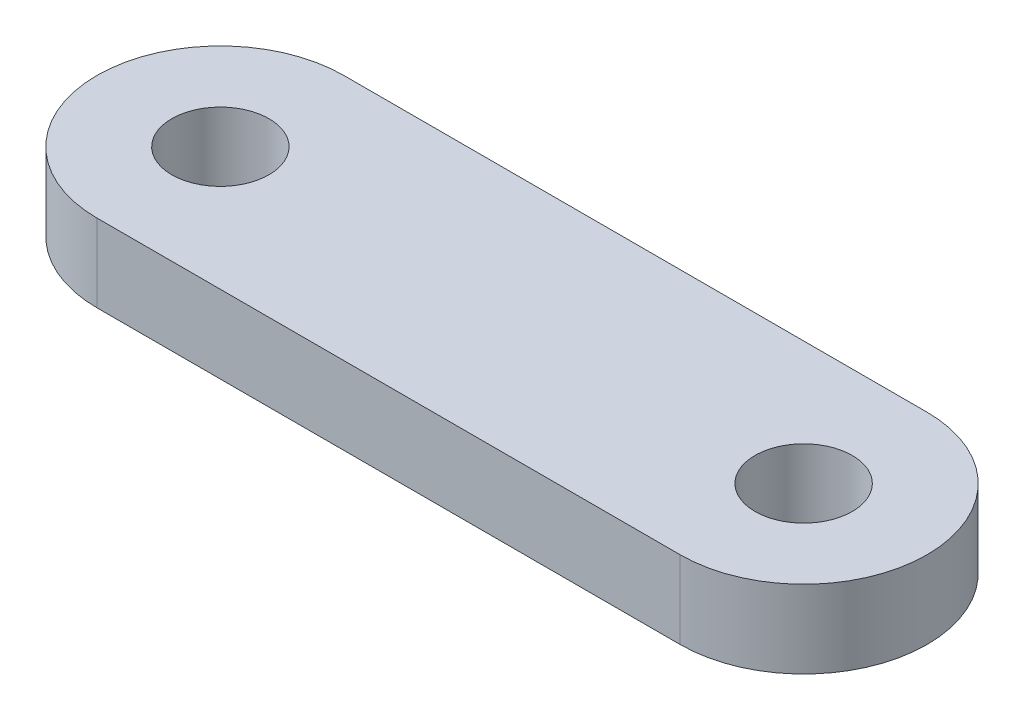
ISO-10303-21;
HEADER;
FILE_DESCRIPTION(('STEP AP214'),'2;1');
FILE_NAME('part.step','',(''),(''),'','','');
FILE_SCHEMA(('AUTOMOTIVE_DESIGN { 1 0 10303 214 1 1 1 1 }'));
ENDSEC;
DATA;
#1=APPLICATION_CONTEXT('core data for automotive mechanical design processes');
#2=APPLICATION_PROTOCOL_DEFINITION('international standard','automotive_design',2000,#1);
#3=PRODUCT_CONTEXT('',#1,'mechanical');
#4=PRODUCT('Part','Part','',(#3));
#5=PRODUCT_RELATED_PRODUCT_CATEGORY('part','',(#4));
#6=PRODUCT_DEFINITION_FORMATION('','',#4);
#7=PRODUCT_DEFINITION_CONTEXT('part definition',#1,'design');
#8=PRODUCT_DEFINITION('design','',#6,#7);
#9=PRODUCT_DEFINITION_SHAPE('','',#8);
#10=(LENGTH_UNIT() NAMED_UNIT(*) SI_UNIT(.MILLI.,.METRE.));
#11=(NAMED_UNIT(*) PLANE_ANGLE_UNIT() SI_UNIT($,.RADIAN.));
#12=(NAMED_UNIT(*) SI_UNIT($,.STERADIAN.) SOLID_ANGLE_UNIT());
#13=UNCERTAINTY_MEASURE_WITH_UNIT(LENGTH_MEASURE(1.E-05),#10,'distance_accuracy_value','');
#14=(GEOMETRIC_REPRESENTATION_CONTEXT(3) GLOBAL_UNCERTAINTY_ASSIGNED_CONTEXT((#13)) GLOBAL_UNIT_ASSIGNED_CONTEXT((#10,
#11,#12)) REPRESENTATION_CONTEXT('',''));
#15=CARTESIAN_POINT('',(0.,0.,0.));
#16=DIRECTION('',(0.,0.,1.));
#17=DIRECTION('',(1.,0.,0.));
#18=AXIS2_PLACEMENT_3D('',#15,#16,#17);
#19=CARTESIAN_POINT('',(-30.,4.,0.));
#20=DIRECTION('',(0.,1.,0.));
#21=DIRECTION('',(0.,0.,1.));
#22=AXIS2_PLACEMENT_3D('',#19,#20,#21);
#23=PLANE('',#22);
#24=CARTESIAN_POINT('',(-30.,4.,0.));
#25=DIRECTION('',(0.,1.,0.));
#26=DIRECTION('',(0.,0.,1.));
#27=AXIS2_PLACEMENT_3D('',#24,#25,#26);
#28=CIRCLE('',#27,5.);
#29=CARTESIAN_POINT('',(-30.,4.,5.));
#30=VERTEX_POINT('',#29);
#31=EDGE_CURVE('E105',#30,#30,#28,.T.);
#32=ORIENTED_EDGE('',*,*,#31,.F.);
#33=EDGE_LOOP('',(#32));
#34=FACE_BOUND('',#33,.T.);
#35=CARTESIAN_POINT('',(-30.,4.,0.));
#36=DIRECTION('',(0.,1.,0.));
#37=DIRECTION('',(0.,0.,1.));
#38=AXIS2_PLACEMENT_3D('',#35,#36,#37);
#39=CIRCLE('',#38,12.7);
#40=CARTESIAN_POINT('',(-30.,4.,-12.7));
#41=VERTEX_POINT('',#40);
#42=CARTESIAN_POINT('',(-30.,4.,12.7));
#43=VERTEX_POINT('',#42);
#44=EDGE_CURVE('E90',#41,#43,#39,.T.);
#45=ORIENTED_EDGE('',*,*,#44,.T.);
#46=DIRECTION('',(1.,0.,0.));
#47=VECTOR('',#46,1.);
#48=CARTESIAN_POINT('',(-30.,4.,12.7));
#49=LINE('',#48,#47);
#50=CARTESIAN_POINT('',(30.,4.,12.7));
#51=VERTEX_POINT('',#50);
#52=EDGE_CURVE('E85',#43,#51,#49,.T.);
#53=ORIENTED_EDGE('',*,*,#52,.T.);
#54=CARTESIAN_POINT('',(30.,4.,0.));
#55=DIRECTION('',(0.,1.,0.));
#56=DIRECTION('',(0.,0.,-1.));
#57=AXIS2_PLACEMENT_3D('',#54,#55,#56);
#58=CIRCLE('',#57,12.7);
#59=CARTESIAN_POINT('',(30.,4.,-12.7));
#60=VERTEX_POINT('',#59);
#61=EDGE_CURVE('E88',#51,#60,#58,.T.);
#62=ORIENTED_EDGE('',*,*,#61,.T.);
#63=DIRECTION('',(-1.,0.,0.));
#64=VECTOR('',#63,1.);
#65=CARTESIAN_POINT('',(-30.,4.,-12.7));
#66=LINE('',#65,#64);
#67=EDGE_CURVE('E55',#60,#41,#66,.T.);
#68=ORIENTED_EDGE('',*,*,#67,.T.);
#69=EDGE_LOOP('',(#45,#53,#62,#68));
#70=FACE_BOUND('',#69,.T.);
#71=CARTESIAN_POINT('',(30.,4.,0.));
#72=DIRECTION('',(0.,1.,0.));
#73=DIRECTION('',(0.,0.,1.));
#74=AXIS2_PLACEMENT_3D('',#71,#72,#73);
#75=CIRCLE('',#74,5.);
#76=CARTESIAN_POINT('',(30.,4.,5.));
#77=VERTEX_POINT('',#76);
#78=EDGE_CURVE('E120',#77,#77,#75,.T.);
#79=ORIENTED_EDGE('',*,*,#78,.F.);
#80=EDGE_LOOP('',(#79));
#81=FACE_BOUND('',#80,.T.);
#82=ADVANCED_FACE('F38',(#34,#70,#81),#23,.T.);
#83=CARTESIAN_POINT('',(-30.,-4.,0.));
#84=DIRECTION('',(0.,1.,0.));
#85=DIRECTION('',(0.,0.,1.));
#86=AXIS2_PLACEMENT_3D('',#83,#84,#85);
#87=PLANE('',#86);
#88=CARTESIAN_POINT('',(-30.,-4.,0.));
#89=DIRECTION('',(0.,1.,0.));
#90=DIRECTION('',(0.,0.,1.));
#91=AXIS2_PLACEMENT_3D('',#88,#89,#90);
#92=CIRCLE('',#91,12.7);
#93=CARTESIAN_POINT('',(-30.,-4.,-12.7));
#94=VERTEX_POINT('',#93);
#95=CARTESIAN_POINT('',(-30.,-4.,12.7));
#96=VERTEX_POINT('',#95);
#97=EDGE_CURVE('E102',#94,#96,#92,.T.);
#98=ORIENTED_EDGE('',*,*,#97,.F.);
#99=DIRECTION('',(-1.,0.,0.));
#100=VECTOR('',#99,1.);
#101=CARTESIAN_POINT('',(-30.,-4.,-12.7));
#102=LINE('',#101,#100);
#103=CARTESIAN_POINT('',(30.,-4.,-12.7));
#104=VERTEX_POINT('',#103);
#105=EDGE_CURVE('E78',#104,#94,#102,.T.);
#106=ORIENTED_EDGE('',*,*,#105,.F.);
#107=CARTESIAN_POINT('',(30.,-4.,0.));
#108=DIRECTION('',(0.,1.,0.));
#109=DIRECTION('',(0.,0.,-1.));
#110=AXIS2_PLACEMENT_3D('',#107,#108,#109);
#111=CIRCLE('',#110,12.7);
#112=CARTESIAN_POINT('',(30.,-4.,12.7));
#113=VERTEX_POINT('',#112);
#114=EDGE_CURVE('E72',#113,#104,#111,.T.);
#115=ORIENTED_EDGE('',*,*,#114,.F.);
#116=DIRECTION('',(1.,0.,0.));
#117=VECTOR('',#116,1.);
#118=CARTESIAN_POINT('',(-30.,-4.,12.7));
#119=LINE('',#118,#117);
#120=EDGE_CURVE('E94',#96,#113,#119,.T.);
#121=ORIENTED_EDGE('',*,*,#120,.F.);
#122=EDGE_LOOP('',(#98,#106,#115,#121));
#123=FACE_BOUND('',#122,.T.);
#124=CARTESIAN_POINT('',(-30.,-4.,0.));
#125=DIRECTION('',(0.,1.,0.));
#126=DIRECTION('',(0.,0.,1.));
#127=AXIS2_PLACEMENT_3D('',#124,#125,#126);
#128=CIRCLE('',#127,5.);
#129=CARTESIAN_POINT('',(-30.,-4.,5.));
#130=VERTEX_POINT('',#129);
#131=EDGE_CURVE('E117',#130,#130,#128,.T.);
#132=ORIENTED_EDGE('',*,*,#131,.T.);
#133=EDGE_LOOP('',(#132));
#134=FACE_BOUND('',#133,.T.);
#135=CARTESIAN_POINT('',(30.,-4.,0.));
#136=DIRECTION('',(0.,1.,0.));
#137=DIRECTION('',(0.,0.,1.));
#138=AXIS2_PLACEMENT_3D('',#135,#136,#137);
#139=CIRCLE('',#138,5.);
#140=CARTESIAN_POINT('',(30.,-4.,5.));
#141=VERTEX_POINT('',#140);
#142=EDGE_CURVE('E123',#141,#141,#139,.T.);
#143=ORIENTED_EDGE('',*,*,#142,.T.);
#144=EDGE_LOOP('',(#143));
#145=FACE_BOUND('',#144,.T.);
#146=ADVANCED_FACE('F113',(#123,#134,#145),#87,.F.);
#147=CARTESIAN_POINT('',(-30.,4.,0.));
#148=DIRECTION('',(0.,-1.,0.));
#149=DIRECTION('',(0.,0.,-1.));
#150=AXIS2_PLACEMENT_3D('',#147,#148,#149);
#151=CYLINDRICAL_SURFACE('',#150,12.7);
#152=ORIENTED_EDGE('',*,*,#97,.T.);
#153=DIRECTION('',(0.,-1.,0.));
#154=VECTOR('',#153,1.);
#155=CARTESIAN_POINT('',(-30.,4.,12.7));
#156=LINE('',#155,#154);
#157=EDGE_CURVE('E11',#43,#96,#156,.T.);
#158=ORIENTED_EDGE('',*,*,#157,.F.);
#159=ORIENTED_EDGE('',*,*,#44,.F.);
#160=DIRECTION('',(0.,-1.,0.));
#161=VECTOR('',#160,1.);
#162=CARTESIAN_POINT('',(-30.,4.,-12.7));
#163=LINE('',#162,#161);
#164=EDGE_CURVE('E98',#41,#94,#163,.T.);
#165=ORIENTED_EDGE('',*,*,#164,.T.);
#166=EDGE_LOOP('',(#152,#158,#159,#165));
#167=FACE_BOUND('',#166,.T.);
#168=ADVANCED_FACE('F40',(#167),#151,.T.);
#169=CARTESIAN_POINT('',(-30.,4.,12.7));
#170=DIRECTION('',(0.,0.,-1.));
#171=DIRECTION('',(-1.,0.,0.));
#172=AXIS2_PLACEMENT_3D('',#169,#170,#171);
#173=PLANE('',#172);
#174=ORIENTED_EDGE('',*,*,#120,.T.);
#175=DIRECTION('',(0.,-1.,0.));
#176=VECTOR('',#175,1.);
#177=CARTESIAN_POINT('',(30.,4.,12.7));
#178=LINE('',#177,#176);
#179=EDGE_CURVE('E47',#51,#113,#178,.T.);
#180=ORIENTED_EDGE('',*,*,#179,.F.);
#181=ORIENTED_EDGE('',*,*,#52,.F.);
#182=ORIENTED_EDGE('',*,*,#157,.T.);
#183=EDGE_LOOP('',(#174,#180,#181,#182));
#184=FACE_BOUND('',#183,.T.);
#185=ADVANCED_FACE('F93',(#184),#173,.F.);
#186=CARTESIAN_POINT('',(30.,4.,0.));
#187=DIRECTION('',(0.,-1.,0.));
#188=DIRECTION('',(0.,0.,-1.));
#189=AXIS2_PLACEMENT_3D('',#186,#187,#188);
#190=CYLINDRICAL_SURFACE('',#189,12.7);
#191=ORIENTED_EDGE('',*,*,#114,.T.);
#192=DIRECTION('',(0.,-1.,0.));
#193=VECTOR('',#192,1.);
#194=CARTESIAN_POINT('',(30.,4.,-12.7));
#195=LINE('',#194,#193);
#196=EDGE_CURVE('E95',#60,#104,#195,.T.);
#197=ORIENTED_EDGE('',*,*,#196,.F.);
#198=ORIENTED_EDGE('',*,*,#61,.F.);
#199=ORIENTED_EDGE('',*,*,#179,.T.);
#200=EDGE_LOOP('',(#191,#197,#198,#199));
#201=FACE_BOUND('',#200,.T.);
#202=ADVANCED_FACE('F96',(#201),#190,.T.);
#203=CARTESIAN_POINT('',(-30.,4.,-12.7));
#204=DIRECTION('',(0.,0.,1.));
#205=DIRECTION('',(1.,0.,0.));
#206=AXIS2_PLACEMENT_3D('',#203,#204,#205);
#207=PLANE('',#206);
#208=ORIENTED_EDGE('',*,*,#105,.T.);
#209=ORIENTED_EDGE('',*,*,#164,.F.);
#210=ORIENTED_EDGE('',*,*,#67,.F.);
#211=ORIENTED_EDGE('',*,*,#196,.T.);
#212=EDGE_LOOP('',(#208,#209,#210,#211));
#213=FACE_BOUND('',#212,.T.);
#214=ADVANCED_FACE('F110',(#213),#207,.F.);
#215=CARTESIAN_POINT('',(-30.,4.,0.));
#216=DIRECTION('',(0.,-1.,0.));
#217=DIRECTION('',(0.,0.,-1.));
#218=AXIS2_PLACEMENT_3D('',#215,#216,#217);
#219=CYLINDRICAL_SURFACE('',#218,5.);
#220=ORIENTED_EDGE('',*,*,#31,.T.);
#221=EDGE_LOOP('',(#220));
#222=FACE_BOUND('',#221,.T.);
#223=ORIENTED_EDGE('',*,*,#131,.F.);
#224=EDGE_LOOP('',(#223));
#225=FACE_BOUND('',#224,.T.);
#226=ADVANCED_FACE('F140',(#222,#225),#219,.F.);
#227=CARTESIAN_POINT('',(30.,4.,0.));
#228=DIRECTION('',(0.,-1.,0.));
#229=DIRECTION('',(0.,0.,-1.));
#230=AXIS2_PLACEMENT_3D('',#227,#228,#229);
#231=CYLINDRICAL_SURFACE('',#230,5.);
#232=ORIENTED_EDGE('',*,*,#78,.T.);
#233=EDGE_LOOP('',(#232));
#234=FACE_BOUND('',#233,.T.);
#235=ORIENTED_EDGE('',*,*,#142,.F.);
#236=EDGE_LOOP('',(#235));
#237=FACE_BOUND('',#236,.T.);
#238=ADVANCED_FACE('F129',(#234,#237),#231,.F.);
#239=CLOSED_SHELL('',(#82,#146,#168,#185,#202,#214,#226,#238));
#240=MANIFOLD_SOLID_BREP('B2',#239);
#241=ADVANCED_BREP_SHAPE_REPRESENTATION('',(#18,#240),#14);
#242=SHAPE_DEFINITION_REPRESENTATION(#9,#241);
ENDSEC;
END-ISO-10303-21;
